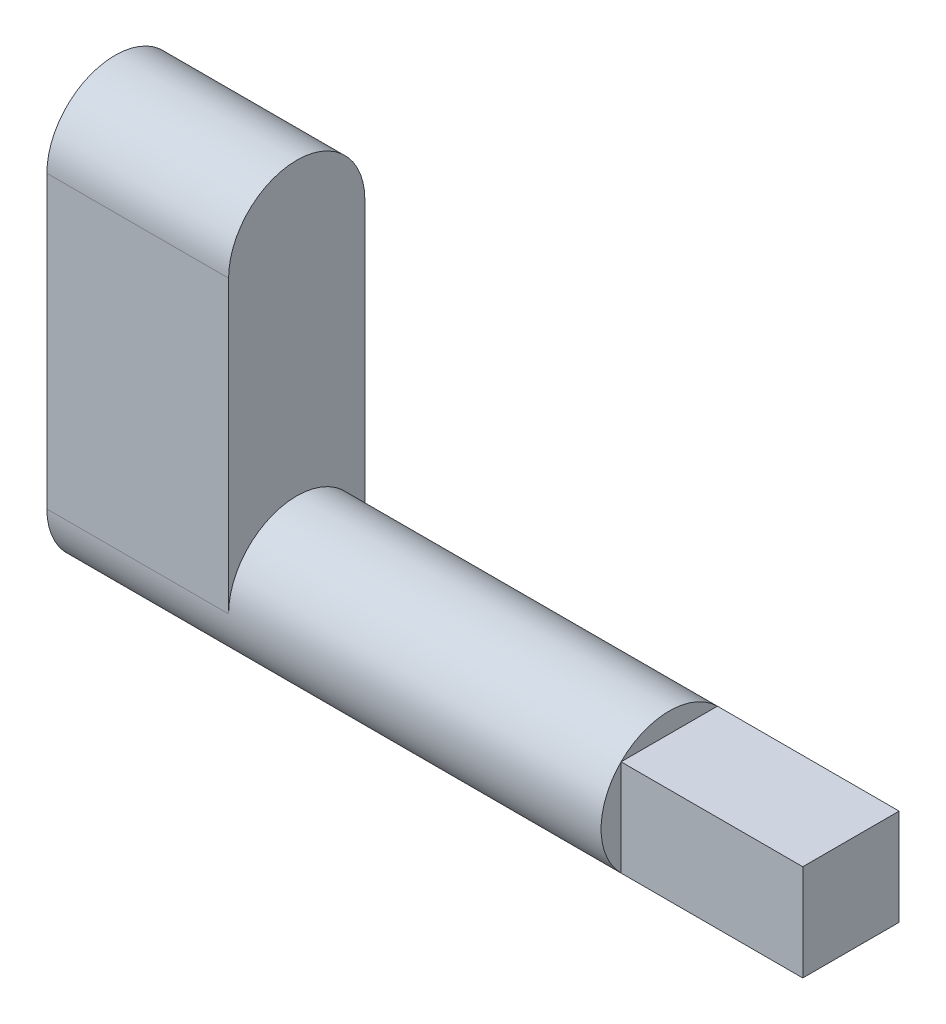
ISO-10303-21;
HEADER;
FILE_DESCRIPTION(('STEP AP214'),'2;1');
FILE_NAME('part.step','',(''),(''),'','','');
FILE_SCHEMA(('AUTOMOTIVE_DESIGN { 1 0 10303 214 1 1 1 1 }'));
ENDSEC;
DATA;
#1=APPLICATION_CONTEXT('core data for automotive mechanical design processes');
#2=APPLICATION_PROTOCOL_DEFINITION('international standard','automotive_design',2000,#1);
#3=PRODUCT_CONTEXT('',#1,'mechanical');
#4=PRODUCT('Part','Part','',(#3));
#5=PRODUCT_RELATED_PRODUCT_CATEGORY('part','',(#4));
#6=PRODUCT_DEFINITION_FORMATION('','',#4);
#7=PRODUCT_DEFINITION_CONTEXT('part definition',#1,'design');
#8=PRODUCT_DEFINITION('design','',#6,#7);
#9=PRODUCT_DEFINITION_SHAPE('','',#8);
#10=(LENGTH_UNIT() NAMED_UNIT(*) SI_UNIT(.MILLI.,.METRE.));
#11=(NAMED_UNIT(*) PLANE_ANGLE_UNIT() SI_UNIT($,.RADIAN.));
#12=(NAMED_UNIT(*) SI_UNIT($,.STERADIAN.) SOLID_ANGLE_UNIT());
#13=UNCERTAINTY_MEASURE_WITH_UNIT(LENGTH_MEASURE(1.E-05),#10,'distance_accuracy_value','');
#14=(GEOMETRIC_REPRESENTATION_CONTEXT(3) GLOBAL_UNCERTAINTY_ASSIGNED_CONTEXT((#13)) GLOBAL_UNIT_ASSIGNED_CONTEXT((#10,
#11,#12)) REPRESENTATION_CONTEXT('',''));
#15=CARTESIAN_POINT('',(0.,0.,0.));
#16=DIRECTION('',(0.,0.,1.));
#17=DIRECTION('',(1.,0.,0.));
#18=AXIS2_PLACEMENT_3D('',#15,#16,#17);
#19=CARTESIAN_POINT('',(0.,0.,0.));
#20=DIRECTION('',(1.,0.,0.));
#21=DIRECTION('',(0.,0.,-1.));
#22=AXIS2_PLACEMENT_3D('',#19,#20,#21);
#23=PLANE('',#22);
#24=DIRECTION('',(0.,-1.,0.));
#25=VECTOR('',#24,1.);
#26=CARTESIAN_POINT('',(0.,-2.65165042944955,2.65165042944955));
#27=LINE('',#26,#25);
#28=CARTESIAN_POINT('',(0.,2.65165042944955,2.65165042944955));
#29=VERTEX_POINT('',#28);
#30=CARTESIAN_POINT('',(0.,-2.65165042944955,2.65165042944955));
#31=VERTEX_POINT('',#30);
#32=EDGE_CURVE('E131',#29,#31,#27,.T.);
#33=ORIENTED_EDGE('',*,*,#32,.F.);
#34=CARTESIAN_POINT('',(0.,0.,0.));
#35=DIRECTION('',(1.,0.,0.));
#36=DIRECTION('',(0.,0.,-1.));
#37=AXIS2_PLACEMENT_3D('',#34,#35,#36);
#38=CIRCLE('',#37,3.75);
#39=EDGE_CURVE('E169',#29,#31,#38,.T.);
#40=ORIENTED_EDGE('',*,*,#39,.T.);
#41=EDGE_LOOP('',(#33,#40));
#42=FACE_BOUND('',#41,.T.);
#43=ADVANCED_FACE('F37',(#42),#23,.T.);
#44=DIRECTION('',(0.,0.,1.));
#45=VECTOR('',#44,1.);
#46=CARTESIAN_POINT('',(0.,2.65165042944955,-2.65165042944955));
#47=LINE('',#46,#45);
#48=CARTESIAN_POINT('',(0.,2.65165042944955,-2.65165042944955));
#49=VERTEX_POINT('',#48);
#50=EDGE_CURVE('E138',#49,#29,#47,.T.);
#51=ORIENTED_EDGE('',*,*,#50,.F.);
#52=EDGE_CURVE('E167',#49,#29,#38,.T.);
#53=ORIENTED_EDGE('',*,*,#52,.T.);
#54=EDGE_LOOP('',(#51,#53));
#55=FACE_BOUND('',#54,.T.);
#56=ADVANCED_FACE('F201',(#55),#23,.T.);
#57=DIRECTION('',(0.,1.,0.));
#58=VECTOR('',#57,1.);
#59=CARTESIAN_POINT('',(0.,-2.65165042944955,-2.65165042944955));
#60=LINE('',#59,#58);
#61=CARTESIAN_POINT('',(0.,-2.65165042944955,-2.65165042944955));
#62=VERTEX_POINT('',#61);
#63=EDGE_CURVE('E150',#62,#49,#60,.T.);
#64=ORIENTED_EDGE('',*,*,#63,.F.);
#65=EDGE_CURVE('E166',#62,#49,#38,.T.);
#66=ORIENTED_EDGE('',*,*,#65,.T.);
#67=EDGE_LOOP('',(#64,#66));
#68=FACE_BOUND('',#67,.T.);
#69=ADVANCED_FACE('F183',(#68),#23,.T.);
#70=CARTESIAN_POINT('',(-30.5,0.,0.));
#71=DIRECTION('',(1.,0.,0.));
#72=DIRECTION('',(0.,0.,-1.));
#73=AXIS2_PLACEMENT_3D('',#70,#71,#72);
#74=CYLINDRICAL_SURFACE('',#73,3.75);
#75=DIRECTION('',(-1.,0.,0.));
#76=VECTOR('',#75,1.);
#77=CARTESIAN_POINT('',(-20.5,0.,-3.75));
#78=LINE('',#77,#76);
#79=CARTESIAN_POINT('',(-20.5,0.,-3.75));
#80=VERTEX_POINT('',#79);
#81=CARTESIAN_POINT('',(-30.5,0.,-3.75));
#82=VERTEX_POINT('',#81);
#83=EDGE_CURVE('E55',#80,#82,#78,.T.);
#84=ORIENTED_EDGE('',*,*,#83,.F.);
#85=CARTESIAN_POINT('',(-20.5,0.,0.));
#86=DIRECTION('',(-1.,0.,0.));
#87=DIRECTION('',(0.,0.,1.));
#88=AXIS2_PLACEMENT_3D('',#85,#86,#87);
#89=CIRCLE('',#88,3.75);
#90=CARTESIAN_POINT('',(-20.5,0.,3.75));
#91=VERTEX_POINT('',#90);
#92=EDGE_CURVE('E11',#80,#91,#89,.F.);
#93=ORIENTED_EDGE('',*,*,#92,.T.);
#94=DIRECTION('',(-1.,0.,0.));
#95=VECTOR('',#94,1.);
#96=CARTESIAN_POINT('',(-20.5,0.,3.75));
#97=LINE('',#96,#95);
#98=CARTESIAN_POINT('',(-30.5,0.,3.75));
#99=VERTEX_POINT('',#98);
#100=EDGE_CURVE('E111',#91,#99,#97,.T.);
#101=ORIENTED_EDGE('',*,*,#100,.T.);
#102=CARTESIAN_POINT('',(-30.5,0.,0.));
#103=DIRECTION('',(1.,0.,0.));
#104=DIRECTION('',(0.,0.,-1.));
#105=AXIS2_PLACEMENT_3D('',#102,#103,#104);
#106=CIRCLE('',#105,3.75);
#107=EDGE_CURVE('E45',#99,#82,#106,.T.);
#108=ORIENTED_EDGE('',*,*,#107,.T.);
#109=EDGE_LOOP('',(#84,#93,#101,#108));
#110=FACE_BOUND('',#109,.T.);
#111=ORIENTED_EDGE('',*,*,#52,.F.);
#112=ORIENTED_EDGE('',*,*,#65,.F.);
#113=EDGE_CURVE('E173',#31,#62,#38,.T.);
#114=ORIENTED_EDGE('',*,*,#113,.F.);
#115=ORIENTED_EDGE('',*,*,#39,.F.);
#116=EDGE_LOOP('',(#111,#112,#114,#115));
#117=FACE_BOUND('',#116,.T.);
#118=ADVANCED_FACE('F39',(#110,#117),#74,.T.);
#119=CARTESIAN_POINT('',(-30.5,0.,0.));
#120=DIRECTION('',(1.,0.,0.));
#121=DIRECTION('',(0.,0.,-1.));
#122=AXIS2_PLACEMENT_3D('',#119,#120,#121);
#123=PLANE('',#122);
#124=ORIENTED_EDGE('',*,*,#107,.F.);
#125=DIRECTION('',(0.,1.,0.));
#126=VECTOR('',#125,1.);
#127=CARTESIAN_POINT('',(-30.5,16.,3.75));
#128=LINE('',#127,#126);
#129=CARTESIAN_POINT('',(-30.5,16.,3.75));
#130=VERTEX_POINT('',#129);
#131=EDGE_CURVE('E127',#99,#130,#128,.T.);
#132=ORIENTED_EDGE('',*,*,#131,.T.);
#133=CARTESIAN_POINT('',(-30.5,16.,0.));
#134=DIRECTION('',(-1.,0.,0.));
#135=DIRECTION('',(0.,0.,-1.));
#136=AXIS2_PLACEMENT_3D('',#133,#134,#135);
#137=CIRCLE('',#136,3.75);
#138=CARTESIAN_POINT('',(-30.5,16.,-3.75));
#139=VERTEX_POINT('',#138);
#140=EDGE_CURVE('E105',#130,#139,#137,.T.);
#141=ORIENTED_EDGE('',*,*,#140,.T.);
#142=DIRECTION('',(0.,-1.,0.));
#143=VECTOR('',#142,1.);
#144=CARTESIAN_POINT('',(-30.5,0.,-3.75));
#145=LINE('',#144,#143);
#146=EDGE_CURVE('E121',#139,#82,#145,.T.);
#147=ORIENTED_EDGE('',*,*,#146,.T.);
#148=EDGE_LOOP('',(#124,#132,#141,#147));
#149=FACE_BOUND('',#148,.T.);
#150=ADVANCED_FACE('F207',(#149),#123,.F.);
#151=DIRECTION('',(0.,0.,-1.));
#152=VECTOR('',#151,1.);
#153=CARTESIAN_POINT('',(0.,-2.65165042944955,-2.65165042944955));
#154=LINE('',#153,#152);
#155=EDGE_CURVE('E147',#31,#62,#154,.T.);
#156=ORIENTED_EDGE('',*,*,#155,.F.);
#157=ORIENTED_EDGE('',*,*,#113,.T.);
#158=EDGE_LOOP('',(#156,#157));
#159=FACE_BOUND('',#158,.T.);
#160=ADVANCED_FACE('F180',(#159),#23,.T.);
#161=CARTESIAN_POINT('',(10.,-2.65165042944955,2.65165042944955));
#162=DIRECTION('',(0.,0.,-1.));
#163=DIRECTION('',(-1.,0.,0.));
#164=AXIS2_PLACEMENT_3D('',#161,#162,#163);
#165=PLANE('',#164);
#166=ORIENTED_EDGE('',*,*,#32,.T.);
#167=DIRECTION('',(-1.,0.,0.));
#168=VECTOR('',#167,1.);
#169=CARTESIAN_POINT('',(10.,-2.65165042944955,2.65165042944955));
#170=LINE('',#169,#168);
#171=CARTESIAN_POINT('',(10.,-2.65165042944955,2.65165042944955));
#172=VERTEX_POINT('',#171);
#173=EDGE_CURVE('E163',#172,#31,#170,.T.);
#174=ORIENTED_EDGE('',*,*,#173,.F.);
#175=DIRECTION('',(0.,-1.,0.));
#176=VECTOR('',#175,1.);
#177=CARTESIAN_POINT('',(10.,-2.65165042944955,2.65165042944955));
#178=LINE('',#177,#176);
#179=CARTESIAN_POINT('',(10.,2.65165042944955,2.65165042944955));
#180=VERTEX_POINT('',#179);
#181=EDGE_CURVE('E134',#180,#172,#178,.T.);
#182=ORIENTED_EDGE('',*,*,#181,.F.);
#183=DIRECTION('',(-1.,0.,0.));
#184=VECTOR('',#183,1.);
#185=CARTESIAN_POINT('',(10.,2.65165042944955,2.65165042944955));
#186=LINE('',#185,#184);
#187=EDGE_CURVE('E144',#180,#29,#186,.T.);
#188=ORIENTED_EDGE('',*,*,#187,.T.);
#189=EDGE_LOOP('',(#166,#174,#182,#188));
#190=FACE_BOUND('',#189,.T.);
#191=ADVANCED_FACE('F198',(#190),#165,.F.);
#192=CARTESIAN_POINT('',(10.,-2.65165042944955,-2.65165042944955));
#193=DIRECTION('',(0.,1.,0.));
#194=DIRECTION('',(0.,0.,1.));
#195=AXIS2_PLACEMENT_3D('',#192,#193,#194);
#196=PLANE('',#195);
#197=ORIENTED_EDGE('',*,*,#155,.T.);
#198=DIRECTION('',(-1.,0.,0.));
#199=VECTOR('',#198,1.);
#200=CARTESIAN_POINT('',(10.,-2.65165042944955,-2.65165042944955));
#201=LINE('',#200,#199);
#202=CARTESIAN_POINT('',(10.,-2.65165042944955,-2.65165042944955));
#203=VERTEX_POINT('',#202);
#204=EDGE_CURVE('E160',#203,#62,#201,.T.);
#205=ORIENTED_EDGE('',*,*,#204,.F.);
#206=DIRECTION('',(0.,0.,-1.));
#207=VECTOR('',#206,1.);
#208=CARTESIAN_POINT('',(10.,-2.65165042944955,-2.65165042944955));
#209=LINE('',#208,#207);
#210=EDGE_CURVE('E137',#172,#203,#209,.T.);
#211=ORIENTED_EDGE('',*,*,#210,.F.);
#212=ORIENTED_EDGE('',*,*,#173,.T.);
#213=EDGE_LOOP('',(#197,#205,#211,#212));
#214=FACE_BOUND('',#213,.T.);
#215=ADVANCED_FACE('F188',(#214),#196,.F.);
#216=CARTESIAN_POINT('',(10.,-2.65165042944955,-2.65165042944955));
#217=DIRECTION('',(0.,0.,1.));
#218=DIRECTION('',(1.,0.,0.));
#219=AXIS2_PLACEMENT_3D('',#216,#217,#218);
#220=PLANE('',#219);
#221=ORIENTED_EDGE('',*,*,#63,.T.);
#222=DIRECTION('',(-1.,0.,0.));
#223=VECTOR('',#222,1.);
#224=CARTESIAN_POINT('',(10.,2.65165042944955,-2.65165042944955));
#225=LINE('',#224,#223);
#226=CARTESIAN_POINT('',(10.,2.65165042944955,-2.65165042944955));
#227=VERTEX_POINT('',#226);
#228=EDGE_CURVE('E157',#227,#49,#225,.T.);
#229=ORIENTED_EDGE('',*,*,#228,.F.);
#230=DIRECTION('',(0.,1.,0.));
#231=VECTOR('',#230,1.);
#232=CARTESIAN_POINT('',(10.,-2.65165042944955,-2.65165042944955));
#233=LINE('',#232,#231);
#234=EDGE_CURVE('E140',#203,#227,#233,.T.);
#235=ORIENTED_EDGE('',*,*,#234,.F.);
#236=ORIENTED_EDGE('',*,*,#204,.T.);
#237=EDGE_LOOP('',(#221,#229,#235,#236));
#238=FACE_BOUND('',#237,.T.);
#239=ADVANCED_FACE('F191',(#238),#220,.F.);
#240=CARTESIAN_POINT('',(10.,2.65165042944955,-2.65165042944955));
#241=DIRECTION('',(0.,-1.,0.));
#242=DIRECTION('',(0.,0.,-1.));
#243=AXIS2_PLACEMENT_3D('',#240,#241,#242);
#244=PLANE('',#243);
#245=ORIENTED_EDGE('',*,*,#50,.T.);
#246=ORIENTED_EDGE('',*,*,#187,.F.);
#247=DIRECTION('',(0.,0.,1.));
#248=VECTOR('',#247,1.);
#249=CARTESIAN_POINT('',(10.,2.65165042944955,-2.65165042944955));
#250=LINE('',#249,#248);
#251=EDGE_CURVE('E142',#227,#180,#250,.T.);
#252=ORIENTED_EDGE('',*,*,#251,.F.);
#253=ORIENTED_EDGE('',*,*,#228,.T.);
#254=EDGE_LOOP('',(#245,#246,#252,#253));
#255=FACE_BOUND('',#254,.T.);
#256=ADVANCED_FACE('F277',(#255),#244,.F.);
#257=CARTESIAN_POINT('',(10.,0.,0.));
#258=DIRECTION('',(1.,0.,0.));
#259=DIRECTION('',(0.,0.,-1.));
#260=AXIS2_PLACEMENT_3D('',#257,#258,#259);
#261=PLANE('',#260);
#262=ORIENTED_EDGE('',*,*,#181,.T.);
#263=ORIENTED_EDGE('',*,*,#210,.T.);
#264=ORIENTED_EDGE('',*,*,#234,.T.);
#265=ORIENTED_EDGE('',*,*,#251,.T.);
#266=EDGE_LOOP('',(#262,#263,#264,#265));
#267=FACE_BOUND('',#266,.T.);
#268=ADVANCED_FACE('F194',(#267),#261,.T.);
#269=CARTESIAN_POINT('',(-20.5,0.,-3.75));
#270=DIRECTION('',(0.,0.,-1.));
#271=DIRECTION('',(-1.,0.,0.));
#272=AXIS2_PLACEMENT_3D('',#269,#270,#271);
#273=PLANE('',#272);
#274=ORIENTED_EDGE('',*,*,#146,.F.);
#275=DIRECTION('',(-1.,0.,0.));
#276=VECTOR('',#275,1.);
#277=CARTESIAN_POINT('',(-20.5,16.,-3.75));
#278=LINE('',#277,#276);
#279=CARTESIAN_POINT('',(-20.5,16.,-3.75));
#280=VERTEX_POINT('',#279);
#281=EDGE_CURVE('E110',#280,#139,#278,.T.);
#282=ORIENTED_EDGE('',*,*,#281,.F.);
#283=DIRECTION('',(0.,-1.,0.));
#284=VECTOR('',#283,1.);
#285=CARTESIAN_POINT('',(-20.5,0.,-3.75));
#286=LINE('',#285,#284);
#287=EDGE_CURVE('E118',#280,#80,#286,.T.);
#288=ORIENTED_EDGE('',*,*,#287,.T.);
#289=ORIENTED_EDGE('',*,*,#83,.T.);
#290=EDGE_LOOP('',(#274,#282,#288,#289));
#291=FACE_BOUND('',#290,.T.);
#292=ADVANCED_FACE('F233',(#291),#273,.T.);
#293=CARTESIAN_POINT('',(-20.5,16.,0.));
#294=DIRECTION('',(-1.,0.,0.));
#295=DIRECTION('',(0.,0.,1.));
#296=AXIS2_PLACEMENT_3D('',#293,#294,#295);
#297=CYLINDRICAL_SURFACE('',#296,3.75);
#298=ORIENTED_EDGE('',*,*,#140,.F.);
#299=DIRECTION('',(-1.,0.,0.));
#300=VECTOR('',#299,1.);
#301=CARTESIAN_POINT('',(-20.5,16.,3.75));
#302=LINE('',#301,#300);
#303=CARTESIAN_POINT('',(-20.5,16.,3.75));
#304=VERTEX_POINT('',#303);
#305=EDGE_CURVE('E99',#304,#130,#302,.T.);
#306=ORIENTED_EDGE('',*,*,#305,.F.);
#307=CARTESIAN_POINT('',(-20.5,16.,0.));
#308=DIRECTION('',(-1.,0.,0.));
#309=DIRECTION('',(0.,0.,-1.));
#310=AXIS2_PLACEMENT_3D('',#307,#308,#309);
#311=CIRCLE('',#310,3.75);
#312=EDGE_CURVE('E102',#304,#280,#311,.T.);
#313=ORIENTED_EDGE('',*,*,#312,.T.);
#314=ORIENTED_EDGE('',*,*,#281,.T.);
#315=EDGE_LOOP('',(#298,#306,#313,#314));
#316=FACE_BOUND('',#315,.T.);
#317=ADVANCED_FACE('F101',(#316),#297,.T.);
#318=CARTESIAN_POINT('',(-20.5,16.,3.75));
#319=DIRECTION('',(0.,0.,1.));
#320=DIRECTION('',(1.,0.,0.));
#321=AXIS2_PLACEMENT_3D('',#318,#319,#320);
#322=PLANE('',#321);
#323=ORIENTED_EDGE('',*,*,#131,.F.);
#324=ORIENTED_EDGE('',*,*,#100,.F.);
#325=DIRECTION('',(0.,1.,0.));
#326=VECTOR('',#325,1.);
#327=CARTESIAN_POINT('',(-20.5,16.,3.75));
#328=LINE('',#327,#326);
#329=EDGE_CURVE('E116',#91,#304,#328,.T.);
#330=ORIENTED_EDGE('',*,*,#329,.T.);
#331=ORIENTED_EDGE('',*,*,#305,.T.);
#332=EDGE_LOOP('',(#323,#324,#330,#331));
#333=FACE_BOUND('',#332,.T.);
#334=ADVANCED_FACE('F120',(#333),#322,.T.);
#335=CARTESIAN_POINT('',(-20.5,0.,0.));
#336=DIRECTION('',(-1.,0.,0.));
#337=DIRECTION('',(0.,0.,1.));
#338=AXIS2_PLACEMENT_3D('',#335,#336,#337);
#339=PLANE('',#338);
#340=ORIENTED_EDGE('',*,*,#92,.F.);
#341=ORIENTED_EDGE('',*,*,#287,.F.);
#342=ORIENTED_EDGE('',*,*,#312,.F.);
#343=ORIENTED_EDGE('',*,*,#329,.F.);
#344=EDGE_LOOP('',(#340,#341,#342,#343));
#345=FACE_BOUND('',#344,.T.);
#346=ADVANCED_FACE('F115',(#345),#339,.F.);
#347=CLOSED_SHELL('',(#43,#56,#69,#118,#150,#160,#191,#215,#239,#256,#268,#292,#317,#334,#346));
#348=MANIFOLD_SOLID_BREP('B2',#347);
#349=ADVANCED_BREP_SHAPE_REPRESENTATION('',(#18,#348),#14);
#350=SHAPE_DEFINITION_REPRESENTATION(#9,#349);
ENDSEC;
END-ISO-10303-21;
